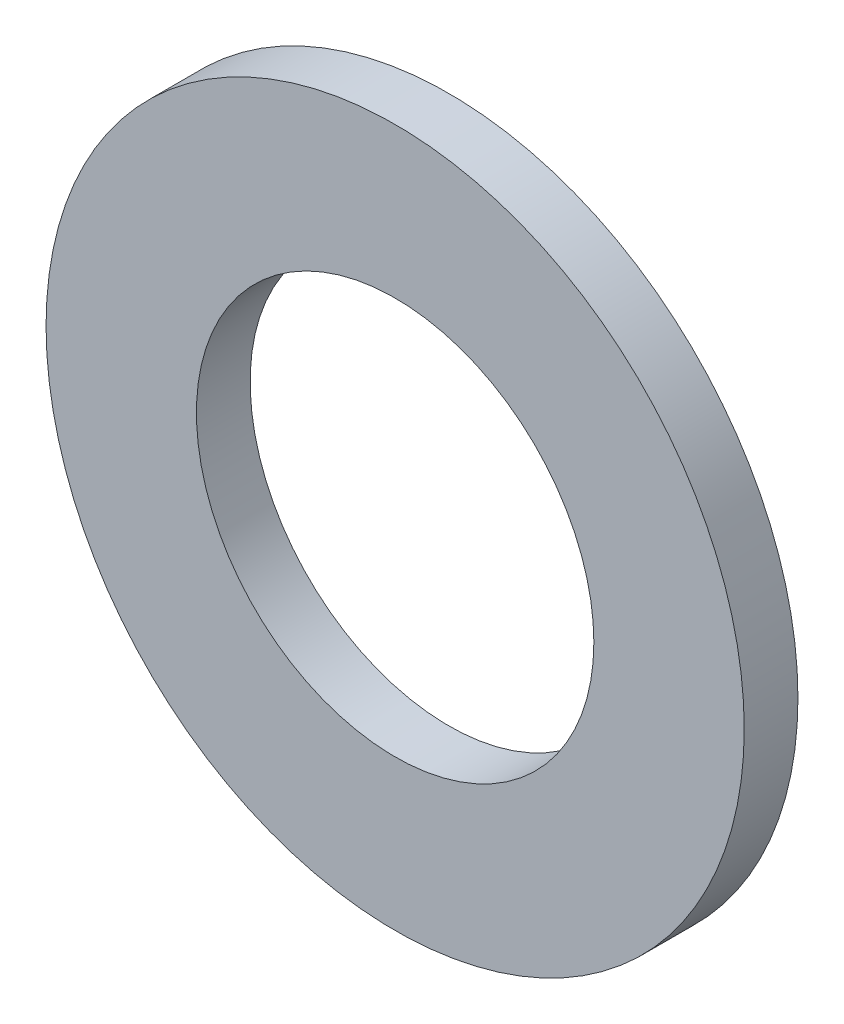
ISO-10303-21;
HEADER;
FILE_DESCRIPTION(('STEP AP214'),'2;1');
FILE_NAME('part.step','',(''),(''),'','','');
FILE_SCHEMA(('AUTOMOTIVE_DESIGN { 1 0 10303 214 1 1 1 1 }'));
ENDSEC;
DATA;
#1=APPLICATION_CONTEXT('core data for automotive mechanical design processes');
#2=APPLICATION_PROTOCOL_DEFINITION('international standard','automotive_design',2000,#1);
#3=PRODUCT_CONTEXT('',#1,'mechanical');
#4=PRODUCT('Part','Part','',(#3));
#5=PRODUCT_RELATED_PRODUCT_CATEGORY('part','',(#4));
#6=PRODUCT_DEFINITION_FORMATION('','',#4);
#7=PRODUCT_DEFINITION_CONTEXT('part definition',#1,'design');
#8=PRODUCT_DEFINITION('design','',#6,#7);
#9=PRODUCT_DEFINITION_SHAPE('','',#8);
#10=(LENGTH_UNIT() NAMED_UNIT(*) SI_UNIT(.MILLI.,.METRE.));
#11=(NAMED_UNIT(*) PLANE_ANGLE_UNIT() SI_UNIT($,.RADIAN.));
#12=(NAMED_UNIT(*) SI_UNIT($,.STERADIAN.) SOLID_ANGLE_UNIT());
#13=UNCERTAINTY_MEASURE_WITH_UNIT(LENGTH_MEASURE(1.E-05),#10,'distance_accuracy_value','');
#14=(GEOMETRIC_REPRESENTATION_CONTEXT(3) GLOBAL_UNCERTAINTY_ASSIGNED_CONTEXT((#13)) GLOBAL_UNIT_ASSIGNED_CONTEXT((#10,
#11,#12)) REPRESENTATION_CONTEXT('',''));
#15=CARTESIAN_POINT('',(0.,0.,0.));
#16=DIRECTION('',(0.,0.,1.));
#17=DIRECTION('',(1.,0.,0.));
#18=AXIS2_PLACEMENT_3D('',#15,#16,#17);
#19=CARTESIAN_POINT('',(0.,0.,5.));
#20=DIRECTION('',(0.,0.,1.));
#21=DIRECTION('',(1.,0.,0.));
#22=AXIS2_PLACEMENT_3D('',#19,#20,#21);
#23=PLANE('',#22);
#24=CARTESIAN_POINT('',(0.,0.,5.));
#25=DIRECTION('',(0.,0.,1.));
#26=DIRECTION('',(1.,0.,0.));
#27=AXIS2_PLACEMENT_3D('',#24,#25,#26);
#28=CIRCLE('',#27,32.5);
#29=CARTESIAN_POINT('',(32.5,0.,5.));
#30=VERTEX_POINT('',#29);
#31=EDGE_CURVE('E10',#30,#30,#28,.T.);
#32=ORIENTED_EDGE('',*,*,#31,.T.);
#33=EDGE_LOOP('',(#32));
#34=FACE_BOUND('',#33,.T.);
#35=CARTESIAN_POINT('',(0.,0.,5.));
#36=DIRECTION('',(0.,0.,1.));
#37=DIRECTION('',(1.,0.,0.));
#38=AXIS2_PLACEMENT_3D('',#35,#36,#37);
#39=CIRCLE('',#38,18.5);
#40=CARTESIAN_POINT('',(18.5,0.,5.));
#41=VERTEX_POINT('',#40);
#42=EDGE_CURVE('E44',#41,#41,#39,.T.);
#43=ORIENTED_EDGE('',*,*,#42,.F.);
#44=EDGE_LOOP('',(#43));
#45=FACE_BOUND('',#44,.T.);
#46=ADVANCED_FACE('F33',(#34,#45),#23,.T.);
#47=CARTESIAN_POINT('',(0.,0.,0.));
#48=DIRECTION('',(0.,0.,1.));
#49=DIRECTION('',(1.,0.,0.));
#50=AXIS2_PLACEMENT_3D('',#47,#48,#49);
#51=PLANE('',#50);
#52=CARTESIAN_POINT('',(0.,0.,0.));
#53=DIRECTION('',(0.,0.,1.));
#54=DIRECTION('',(1.,0.,0.));
#55=AXIS2_PLACEMENT_3D('',#52,#53,#54);
#56=CIRCLE('',#55,32.5);
#57=CARTESIAN_POINT('',(32.5,0.,0.));
#58=VERTEX_POINT('',#57);
#59=EDGE_CURVE('E37',#58,#58,#56,.T.);
#60=ORIENTED_EDGE('',*,*,#59,.F.);
#61=EDGE_LOOP('',(#60));
#62=FACE_BOUND('',#61,.T.);
#63=CARTESIAN_POINT('',(0.,0.,0.));
#64=DIRECTION('',(0.,0.,1.));
#65=DIRECTION('',(1.,0.,0.));
#66=AXIS2_PLACEMENT_3D('',#63,#64,#65);
#67=CIRCLE('',#66,18.5);
#68=CARTESIAN_POINT('',(18.5,0.,0.));
#69=VERTEX_POINT('',#68);
#70=EDGE_CURVE('E46',#69,#69,#67,.T.);
#71=ORIENTED_EDGE('',*,*,#70,.T.);
#72=EDGE_LOOP('',(#71));
#73=FACE_BOUND('',#72,.T.);
#74=ADVANCED_FACE('F56',(#62,#73),#51,.F.);
#75=CARTESIAN_POINT('',(0.,0.,5.));
#76=DIRECTION('',(0.,0.,-1.));
#77=DIRECTION('',(-1.,0.,0.));
#78=AXIS2_PLACEMENT_3D('',#75,#76,#77);
#79=CYLINDRICAL_SURFACE('',#78,32.5);
#80=ORIENTED_EDGE('',*,*,#31,.F.);
#81=EDGE_LOOP('',(#80));
#82=FACE_BOUND('',#81,.T.);
#83=ORIENTED_EDGE('',*,*,#59,.T.);
#84=EDGE_LOOP('',(#83));
#85=FACE_BOUND('',#84,.T.);
#86=ADVANCED_FACE('F35',(#82,#85),#79,.T.);
#87=CARTESIAN_POINT('',(0.,0.,5.));
#88=DIRECTION('',(0.,0.,-1.));
#89=DIRECTION('',(-1.,0.,0.));
#90=AXIS2_PLACEMENT_3D('',#87,#88,#89);
#91=CYLINDRICAL_SURFACE('',#90,18.5);
#92=ORIENTED_EDGE('',*,*,#42,.T.);
#93=EDGE_LOOP('',(#92));
#94=FACE_BOUND('',#93,.T.);
#95=ORIENTED_EDGE('',*,*,#70,.F.);
#96=EDGE_LOOP('',(#95));
#97=FACE_BOUND('',#96,.T.);
#98=ADVANCED_FACE('F52',(#94,#97),#91,.F.);
#99=CLOSED_SHELL('',(#46,#74,#86,#98));
#100=MANIFOLD_SOLID_BREP('B2',#99);
#101=ADVANCED_BREP_SHAPE_REPRESENTATION('',(#18,#100),#14);
#102=SHAPE_DEFINITION_REPRESENTATION(#9,#101);
ENDSEC;
END-ISO-10303-21;
